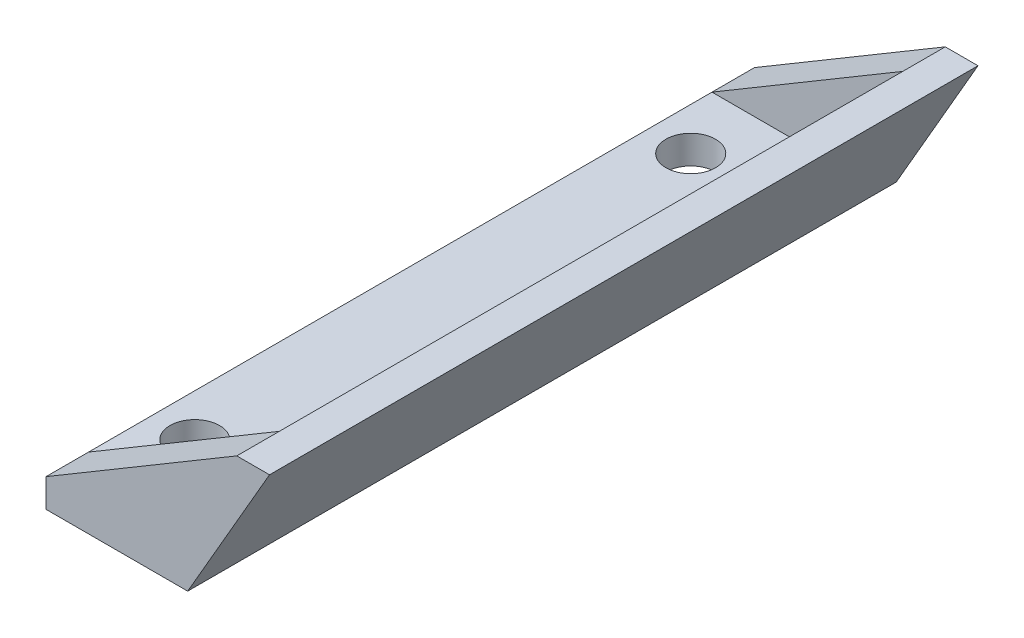
ISO-10303-21;
HEADER;
FILE_DESCRIPTION(('STEP AP214'),'2;1');
FILE_NAME('part.step','',(''),(''),'','','');
FILE_SCHEMA(('AUTOMOTIVE_DESIGN { 1 0 10303 214 1 1 1 1 }'));
ENDSEC;
DATA;
#1=APPLICATION_CONTEXT('core data for automotive mechanical design processes');
#2=APPLICATION_PROTOCOL_DEFINITION('international standard','automotive_design',2000,#1);
#3=PRODUCT_CONTEXT('',#1,'mechanical');
#4=PRODUCT('Part','Part','',(#3));
#5=PRODUCT_RELATED_PRODUCT_CATEGORY('part','',(#4));
#6=PRODUCT_DEFINITION_FORMATION('','',#4);
#7=PRODUCT_DEFINITION_CONTEXT('part definition',#1,'design');
#8=PRODUCT_DEFINITION('design','',#6,#7);
#9=PRODUCT_DEFINITION_SHAPE('','',#8);
#10=(LENGTH_UNIT() NAMED_UNIT(*) SI_UNIT(.MILLI.,.METRE.));
#11=(NAMED_UNIT(*) PLANE_ANGLE_UNIT() SI_UNIT($,.RADIAN.));
#12=(NAMED_UNIT(*) SI_UNIT($,.STERADIAN.) SOLID_ANGLE_UNIT());
#13=UNCERTAINTY_MEASURE_WITH_UNIT(LENGTH_MEASURE(1.E-05),#10,'distance_accuracy_value','');
#14=(GEOMETRIC_REPRESENTATION_CONTEXT(3) GLOBAL_UNCERTAINTY_ASSIGNED_CONTEXT((#13)) GLOBAL_UNIT_ASSIGNED_CONTEXT((#10,
#11,#12)) REPRESENTATION_CONTEXT('',''));
#15=CARTESIAN_POINT('',(0.,0.,0.));
#16=DIRECTION('',(0.,0.,1.));
#17=DIRECTION('',(1.,0.,0.));
#18=AXIS2_PLACEMENT_3D('',#15,#16,#17);
#19=CARTESIAN_POINT('',(-1.15470053837925,2.,-25.));
#20=DIRECTION('',(0.,1.,0.));
#21=DIRECTION('',(-1.,0.,0.));
#22=AXIS2_PLACEMENT_3D('',#19,#20,#21);
#23=PLANE('',#22);
#24=CARTESIAN_POINT('',(-6.99999999999999,2.,17.5));
#25=DIRECTION('',(0.,1.,0.));
#26=DIRECTION('',(-1.,0.,0.));
#27=AXIS2_PLACEMENT_3D('',#24,#25,#26);
#28=CIRCLE('',#27,1.75);
#29=CARTESIAN_POINT('',(-8.75,2.,17.5));
#30=VERTEX_POINT('',#29);
#31=EDGE_CURVE('E167',#30,#30,#28,.T.);
#32=ORIENTED_EDGE('',*,*,#31,.F.);
#33=EDGE_LOOP('',(#32));
#34=FACE_BOUND('',#33,.T.);
#35=CARTESIAN_POINT('',(-6.99999999999999,2.,-17.5));
#36=DIRECTION('',(0.,1.,0.));
#37=DIRECTION('',(-1.,0.,0.));
#38=AXIS2_PLACEMENT_3D('',#35,#36,#37);
#39=CIRCLE('',#38,1.75);
#40=CARTESIAN_POINT('',(-8.75,2.,-17.5));
#41=VERTEX_POINT('',#40);
#42=EDGE_CURVE('E170',#41,#41,#39,.T.);
#43=ORIENTED_EDGE('',*,*,#42,.F.);
#44=EDGE_LOOP('',(#43));
#45=FACE_BOUND('',#44,.T.);
#46=DIRECTION('',(0.,0.,1.));
#47=VECTOR('',#46,1.);
#48=CARTESIAN_POINT('',(-10.,2.,-25.));
#49=LINE('',#48,#47);
#50=CARTESIAN_POINT('',(-10.,2.,-22.));
#51=VERTEX_POINT('',#50);
#52=CARTESIAN_POINT('',(-10.,2.,22.));
#53=VERTEX_POINT('',#52);
#54=EDGE_CURVE('E46',#51,#53,#49,.T.);
#55=ORIENTED_EDGE('',*,*,#54,.T.);
#56=DIRECTION('',(-1.,0.,0.));
#57=VECTOR('',#56,1.);
#58=CARTESIAN_POINT('',(-10.,2.,22.));
#59=LINE('',#58,#57);
#60=CARTESIAN_POINT('',(-1.15470053837925,2.,22.));
#61=VERTEX_POINT('',#60);
#62=EDGE_CURVE('E111',#61,#53,#59,.T.);
#63=ORIENTED_EDGE('',*,*,#62,.F.);
#64=DIRECTION('',(0.,0.,1.));
#65=VECTOR('',#64,1.);
#66=CARTESIAN_POINT('',(-1.15470053837925,2.,-25.));
#67=LINE('',#66,#65);
#68=CARTESIAN_POINT('',(-1.15470053837925,2.,-22.));
#69=VERTEX_POINT('',#68);
#70=EDGE_CURVE('E129',#69,#61,#67,.T.);
#71=ORIENTED_EDGE('',*,*,#70,.F.);
#72=DIRECTION('',(-1.,0.,0.));
#73=VECTOR('',#72,1.);
#74=CARTESIAN_POINT('',(-10.,2.,-22.));
#75=LINE('',#74,#73);
#76=EDGE_CURVE('E54',#69,#51,#75,.T.);
#77=ORIENTED_EDGE('',*,*,#76,.T.);
#78=EDGE_LOOP('',(#55,#63,#71,#77));
#79=FACE_BOUND('',#78,.T.);
#80=ADVANCED_FACE('F37',(#34,#45,#79),#23,.T.);
#81=CARTESIAN_POINT('',(3.46410161513772,10.,-25.));
#82=DIRECTION('',(-0.86602540378444,0.499999999999998,0.));
#83=DIRECTION('',(-0.499999999999998,-0.86602540378444,0.));
#84=AXIS2_PLACEMENT_3D('',#81,#82,#83);
#85=PLANE('',#84);
#86=ORIENTED_EDGE('',*,*,#70,.T.);
#87=DIRECTION('',(-0.499999999999998,-0.86602540378444,0.));
#88=VECTOR('',#87,1.);
#89=CARTESIAN_POINT('',(-1.15470053837925,2.,22.));
#90=LINE('',#89,#88);
#91=CARTESIAN_POINT('',(3.46410161513772,10.,22.));
#92=VERTEX_POINT('',#91);
#93=EDGE_CURVE('E109',#92,#61,#90,.T.);
#94=ORIENTED_EDGE('',*,*,#93,.F.);
#95=DIRECTION('',(0.,0.,1.));
#96=VECTOR('',#95,1.);
#97=CARTESIAN_POINT('',(3.46410161513772,10.,-25.));
#98=LINE('',#97,#96);
#99=CARTESIAN_POINT('',(3.46410161513772,10.,-22.));
#100=VERTEX_POINT('',#99);
#101=EDGE_CURVE('E127',#100,#92,#98,.T.);
#102=ORIENTED_EDGE('',*,*,#101,.F.);
#103=DIRECTION('',(-0.499999999999998,-0.86602540378444,0.));
#104=VECTOR('',#103,1.);
#105=CARTESIAN_POINT('',(-1.15470053837925,2.,-22.));
#106=LINE('',#105,#104);
#107=EDGE_CURVE('E62',#100,#69,#106,.T.);
#108=ORIENTED_EDGE('',*,*,#107,.T.);
#109=EDGE_LOOP('',(#86,#94,#102,#108));
#110=FACE_BOUND('',#109,.T.);
#111=ADVANCED_FACE('F126',(#110),#85,.T.);
#112=CARTESIAN_POINT('',(-10.,2.,-25.));
#113=DIRECTION('',(-1.,0.,0.));
#114=DIRECTION('',(0.,0.,1.));
#115=AXIS2_PLACEMENT_3D('',#112,#113,#114);
#116=PLANE('',#115);
#117=DIRECTION('',(0.,0.,1.));
#118=VECTOR('',#117,1.);
#119=CARTESIAN_POINT('',(-10.,0.,-25.));
#120=LINE('',#119,#118);
#121=CARTESIAN_POINT('',(-10.,0.,-25.));
#122=VERTEX_POINT('',#121);
#123=CARTESIAN_POINT('',(-10.,0.,25.));
#124=VERTEX_POINT('',#123);
#125=EDGE_CURVE('E41',#122,#124,#120,.T.);
#126=ORIENTED_EDGE('',*,*,#125,.T.);
#127=DIRECTION('',(0.,-1.,0.));
#128=VECTOR('',#127,1.);
#129=CARTESIAN_POINT('',(-10.,2.,25.));
#130=LINE('',#129,#128);
#131=CARTESIAN_POINT('',(-10.,2.,25.));
#132=VERTEX_POINT('',#131);
#133=EDGE_CURVE('E164',#132,#124,#130,.T.);
#134=ORIENTED_EDGE('',*,*,#133,.F.);
#135=DIRECTION('',(0.,0.,1.));
#136=VECTOR('',#135,1.);
#137=CARTESIAN_POINT('',(-10.,2.,22.));
#138=LINE('',#137,#136);
#139=EDGE_CURVE('E124',#53,#132,#138,.T.);
#140=ORIENTED_EDGE('',*,*,#139,.F.);
#141=ORIENTED_EDGE('',*,*,#54,.F.);
#142=CARTESIAN_POINT('',(-10.,2.,-25.));
#143=VERTEX_POINT('',#142);
#144=EDGE_CURVE('E11',#143,#51,#49,.T.);
#145=ORIENTED_EDGE('',*,*,#144,.F.);
#146=DIRECTION('',(0.,-1.,0.));
#147=VECTOR('',#146,1.);
#148=CARTESIAN_POINT('',(-10.,2.,-25.));
#149=LINE('',#148,#147);
#150=EDGE_CURVE('E155',#143,#122,#149,.T.);
#151=ORIENTED_EDGE('',*,*,#150,.T.);
#152=EDGE_LOOP('',(#126,#134,#140,#141,#145,#151));
#153=FACE_BOUND('',#152,.T.);
#154=ADVANCED_FACE('F39',(#153),#116,.T.);
#155=CARTESIAN_POINT('',(5.77350269189622,10.,-25.));
#156=DIRECTION('',(0.,1.,0.));
#157=DIRECTION('',(0.,0.,1.));
#158=AXIS2_PLACEMENT_3D('',#155,#156,#157);
#159=PLANE('',#158);
#160=CARTESIAN_POINT('',(3.46410161513772,10.,-25.));
#161=VERTEX_POINT('',#160);
#162=EDGE_CURVE('E133',#161,#100,#98,.T.);
#163=ORIENTED_EDGE('',*,*,#162,.T.);
#164=ORIENTED_EDGE('',*,*,#101,.T.);
#165=DIRECTION('',(0.,0.,1.));
#166=VECTOR('',#165,1.);
#167=CARTESIAN_POINT('',(3.46410161513772,10.,22.));
#168=LINE('',#167,#166);
#169=CARTESIAN_POINT('',(3.46410161513772,10.,25.));
#170=VERTEX_POINT('',#169);
#171=EDGE_CURVE('E117',#92,#170,#168,.T.);
#172=ORIENTED_EDGE('',*,*,#171,.T.);
#173=DIRECTION('',(-1.,0.,0.));
#174=VECTOR('',#173,1.);
#175=CARTESIAN_POINT('',(5.77350269189622,10.,25.));
#176=LINE('',#175,#174);
#177=CARTESIAN_POINT('',(5.77350269189622,10.,25.));
#178=VERTEX_POINT('',#177);
#179=EDGE_CURVE('E157',#178,#170,#176,.T.);
#180=ORIENTED_EDGE('',*,*,#179,.F.);
#181=DIRECTION('',(0.,0.,1.));
#182=VECTOR('',#181,1.);
#183=CARTESIAN_POINT('',(5.77350269189622,10.,-25.));
#184=LINE('',#183,#182);
#185=CARTESIAN_POINT('',(5.77350269189622,10.,-25.));
#186=VERTEX_POINT('',#185);
#187=EDGE_CURVE('E134',#186,#178,#184,.T.);
#188=ORIENTED_EDGE('',*,*,#187,.F.);
#189=DIRECTION('',(-1.,0.,0.));
#190=VECTOR('',#189,1.);
#191=CARTESIAN_POINT('',(5.77350269189622,10.,-25.));
#192=LINE('',#191,#190);
#193=EDGE_CURVE('E143',#186,#161,#192,.T.);
#194=ORIENTED_EDGE('',*,*,#193,.T.);
#195=EDGE_LOOP('',(#163,#164,#172,#180,#188,#194));
#196=FACE_BOUND('',#195,.T.);
#197=ADVANCED_FACE('F131',(#196),#159,.T.);
#198=CARTESIAN_POINT('',(0.,0.,-25.));
#199=DIRECTION('',(0.86602540378444,-0.499999999999998,0.));
#200=DIRECTION('',(0.499999999999998,0.86602540378444,0.));
#201=AXIS2_PLACEMENT_3D('',#198,#199,#200);
#202=PLANE('',#201);
#203=ORIENTED_EDGE('',*,*,#187,.T.);
#204=DIRECTION('',(0.499999999999998,0.86602540378444,0.));
#205=VECTOR('',#204,1.);
#206=CARTESIAN_POINT('',(0.,0.,25.));
#207=LINE('',#206,#205);
#208=CARTESIAN_POINT('',(0.,0.,25.));
#209=VERTEX_POINT('',#208);
#210=EDGE_CURVE('E159',#209,#178,#207,.T.);
#211=ORIENTED_EDGE('',*,*,#210,.F.);
#212=DIRECTION('',(0.,0.,1.));
#213=VECTOR('',#212,1.);
#214=CARTESIAN_POINT('',(0.,0.,-25.));
#215=LINE('',#214,#213);
#216=CARTESIAN_POINT('',(0.,0.,-25.));
#217=VERTEX_POINT('',#216);
#218=EDGE_CURVE('E136',#217,#209,#215,.T.);
#219=ORIENTED_EDGE('',*,*,#218,.F.);
#220=DIRECTION('',(0.499999999999998,0.86602540378444,0.));
#221=VECTOR('',#220,1.);
#222=CARTESIAN_POINT('',(0.,0.,-25.));
#223=LINE('',#222,#221);
#224=EDGE_CURVE('E147',#217,#186,#223,.T.);
#225=ORIENTED_EDGE('',*,*,#224,.T.);
#226=EDGE_LOOP('',(#203,#211,#219,#225));
#227=FACE_BOUND('',#226,.T.);
#228=ADVANCED_FACE('F198',(#227),#202,.T.);
#229=CARTESIAN_POINT('',(-10.,0.,-25.));
#230=DIRECTION('',(0.,-1.,0.));
#231=DIRECTION('',(0.,0.,-1.));
#232=AXIS2_PLACEMENT_3D('',#229,#230,#231);
#233=PLANE('',#232);
#234=CARTESIAN_POINT('',(-6.99999999999999,0.,17.5));
#235=DIRECTION('',(0.,-1.,0.));
#236=DIRECTION('',(0.,0.,-1.));
#237=AXIS2_PLACEMENT_3D('',#234,#235,#236);
#238=CIRCLE('',#237,1.75);
#239=CARTESIAN_POINT('',(-6.99999999999999,0.,15.75));
#240=VERTEX_POINT('',#239);
#241=EDGE_CURVE('E173',#240,#240,#238,.T.);
#242=ORIENTED_EDGE('',*,*,#241,.F.);
#243=EDGE_LOOP('',(#242));
#244=FACE_BOUND('',#243,.T.);
#245=CARTESIAN_POINT('',(-6.99999999999999,0.,-17.5));
#246=DIRECTION('',(0.,-1.,0.));
#247=DIRECTION('',(0.,0.,-1.));
#248=AXIS2_PLACEMENT_3D('',#245,#246,#247);
#249=CIRCLE('',#248,1.75);
#250=CARTESIAN_POINT('',(-6.99999999999999,0.,-19.25));
#251=VERTEX_POINT('',#250);
#252=EDGE_CURVE('E174',#251,#251,#249,.T.);
#253=ORIENTED_EDGE('',*,*,#252,.F.);
#254=EDGE_LOOP('',(#253));
#255=FACE_BOUND('',#254,.T.);
#256=ORIENTED_EDGE('',*,*,#218,.T.);
#257=DIRECTION('',(1.,0.,0.));
#258=VECTOR('',#257,1.);
#259=CARTESIAN_POINT('',(-10.,0.,25.));
#260=LINE('',#259,#258);
#261=EDGE_CURVE('E162',#124,#209,#260,.T.);
#262=ORIENTED_EDGE('',*,*,#261,.F.);
#263=ORIENTED_EDGE('',*,*,#125,.F.);
#264=DIRECTION('',(1.,0.,0.));
#265=VECTOR('',#264,1.);
#266=CARTESIAN_POINT('',(-10.,0.,-25.));
#267=LINE('',#266,#265);
#268=EDGE_CURVE('E151',#122,#217,#267,.T.);
#269=ORIENTED_EDGE('',*,*,#268,.T.);
#270=EDGE_LOOP('',(#256,#262,#263,#269));
#271=FACE_BOUND('',#270,.T.);
#272=ADVANCED_FACE('F200',(#244,#255,#271),#233,.T.);
#273=CARTESIAN_POINT('',(0.,0.,-25.));
#274=DIRECTION('',(0.,0.,1.));
#275=DIRECTION('',(1.,0.,0.));
#276=AXIS2_PLACEMENT_3D('',#273,#274,#275);
#277=PLANE('',#276);
#278=ORIENTED_EDGE('',*,*,#150,.F.);
#279=DIRECTION('',(0.85969522134351,0.51080732805935,0.));
#280=VECTOR('',#279,1.);
#281=CARTESIAN_POINT('',(3.46410161513772,10.,-25.));
#282=LINE('',#281,#280);
#283=EDGE_CURVE('E180',#143,#161,#282,.T.);
#284=ORIENTED_EDGE('',*,*,#283,.T.);
#285=ORIENTED_EDGE('',*,*,#193,.F.);
#286=ORIENTED_EDGE('',*,*,#224,.F.);
#287=ORIENTED_EDGE('',*,*,#268,.F.);
#288=EDGE_LOOP('',(#278,#284,#285,#286,#287));
#289=FACE_BOUND('',#288,.T.);
#290=ADVANCED_FACE('F195',(#289),#277,.F.);
#291=CARTESIAN_POINT('',(0.,0.,25.));
#292=DIRECTION('',(0.,0.,1.));
#293=DIRECTION('',(1.,0.,0.));
#294=AXIS2_PLACEMENT_3D('',#291,#292,#293);
#295=PLANE('',#294);
#296=ORIENTED_EDGE('',*,*,#133,.T.);
#297=ORIENTED_EDGE('',*,*,#261,.T.);
#298=ORIENTED_EDGE('',*,*,#210,.T.);
#299=ORIENTED_EDGE('',*,*,#179,.T.);
#300=DIRECTION('',(0.85969522134351,0.51080732805935,0.));
#301=VECTOR('',#300,1.);
#302=CARTESIAN_POINT('',(3.46410161513772,10.,25.));
#303=LINE('',#302,#301);
#304=EDGE_CURVE('E119',#132,#170,#303,.T.);
#305=ORIENTED_EDGE('',*,*,#304,.F.);
#306=EDGE_LOOP('',(#296,#297,#298,#299,#305));
#307=FACE_BOUND('',#306,.T.);
#308=ADVANCED_FACE('F190',(#307),#295,.T.);
#309=CARTESIAN_POINT('',(-6.99999999999999,10.,-17.5));
#310=DIRECTION('',(0.,-1.,0.));
#311=DIRECTION('',(0.,0.,-1.));
#312=AXIS2_PLACEMENT_3D('',#309,#310,#311);
#313=CYLINDRICAL_SURFACE('',#312,1.75);
#314=ORIENTED_EDGE('',*,*,#42,.T.);
#315=EDGE_LOOP('',(#314));
#316=FACE_BOUND('',#315,.T.);
#317=ORIENTED_EDGE('',*,*,#252,.T.);
#318=EDGE_LOOP('',(#317));
#319=FACE_BOUND('',#318,.T.);
#320=ADVANCED_FACE('F222',(#316,#319),#313,.F.);
#321=CARTESIAN_POINT('',(-6.99999999999999,10.,17.5));
#322=DIRECTION('',(0.,-1.,0.));
#323=DIRECTION('',(0.,0.,-1.));
#324=AXIS2_PLACEMENT_3D('',#321,#322,#323);
#325=CYLINDRICAL_SURFACE('',#324,1.75);
#326=ORIENTED_EDGE('',*,*,#31,.T.);
#327=EDGE_LOOP('',(#326));
#328=FACE_BOUND('',#327,.T.);
#329=ORIENTED_EDGE('',*,*,#241,.T.);
#330=EDGE_LOOP('',(#329));
#331=FACE_BOUND('',#330,.T.);
#332=ADVANCED_FACE('F225',(#328,#331),#325,.F.);
#333=CARTESIAN_POINT('',(3.46410161513772,10.,-22.));
#334=DIRECTION('',(-0.51080732805935,0.85969522134351,0.));
#335=DIRECTION('',(-0.859695221343511,-0.51080732805935,0.));
#336=AXIS2_PLACEMENT_3D('',#333,#334,#335);
#337=PLANE('',#336);
#338=ORIENTED_EDGE('',*,*,#283,.F.);
#339=ORIENTED_EDGE('',*,*,#144,.T.);
#340=DIRECTION('',(0.85969522134351,0.51080732805935,0.));
#341=VECTOR('',#340,1.);
#342=CARTESIAN_POINT('',(3.46410161513772,10.,-22.));
#343=LINE('',#342,#341);
#344=EDGE_CURVE('E177',#51,#100,#343,.T.);
#345=ORIENTED_EDGE('',*,*,#344,.T.);
#346=ORIENTED_EDGE('',*,*,#162,.F.);
#347=EDGE_LOOP('',(#338,#339,#345,#346));
#348=FACE_BOUND('',#347,.T.);
#349=ADVANCED_FACE('F229',(#348),#337,.T.);
#350=CARTESIAN_POINT('',(0.,0.,-22.));
#351=DIRECTION('',(0.,0.,-1.));
#352=DIRECTION('',(-1.,0.,0.));
#353=AXIS2_PLACEMENT_3D('',#350,#351,#352);
#354=PLANE('',#353);
#355=ORIENTED_EDGE('',*,*,#107,.F.);
#356=ORIENTED_EDGE('',*,*,#344,.F.);
#357=ORIENTED_EDGE('',*,*,#76,.F.);
#358=EDGE_LOOP('',(#355,#356,#357));
#359=FACE_BOUND('',#358,.T.);
#360=ADVANCED_FACE('F233',(#359),#354,.F.);
#361=CARTESIAN_POINT('',(3.46410161513772,10.,22.));
#362=DIRECTION('',(0.51080732805935,-0.85969522134351,0.));
#363=DIRECTION('',(0.859695221343511,0.51080732805935,0.));
#364=AXIS2_PLACEMENT_3D('',#361,#362,#363);
#365=PLANE('',#364);
#366=ORIENTED_EDGE('',*,*,#304,.T.);
#367=ORIENTED_EDGE('',*,*,#171,.F.);
#368=DIRECTION('',(0.85969522134351,0.51080732805935,0.));
#369=VECTOR('',#368,1.);
#370=CARTESIAN_POINT('',(3.46410161513772,10.,22.));
#371=LINE('',#370,#369);
#372=EDGE_CURVE('E105',#53,#92,#371,.T.);
#373=ORIENTED_EDGE('',*,*,#372,.F.);
#374=ORIENTED_EDGE('',*,*,#139,.T.);
#375=EDGE_LOOP('',(#366,#367,#373,#374));
#376=FACE_BOUND('',#375,.T.);
#377=ADVANCED_FACE('F118',(#376),#365,.F.);
#378=CARTESIAN_POINT('',(0.,0.,22.));
#379=DIRECTION('',(0.,0.,1.));
#380=DIRECTION('',(-1.,0.,0.));
#381=AXIS2_PLACEMENT_3D('',#378,#379,#380);
#382=PLANE('',#381);
#383=ORIENTED_EDGE('',*,*,#93,.T.);
#384=ORIENTED_EDGE('',*,*,#62,.T.);
#385=ORIENTED_EDGE('',*,*,#372,.T.);
#386=EDGE_LOOP('',(#383,#384,#385));
#387=FACE_BOUND('',#386,.T.);
#388=ADVANCED_FACE('F107',(#387),#382,.F.);
#389=CLOSED_SHELL('',(#80,#111,#154,#197,#228,#272,#290,#308,#320,#332,#349,#360,#377,#388));
#390=MANIFOLD_SOLID_BREP('B2',#389);
#391=ADVANCED_BREP_SHAPE_REPRESENTATION('',(#18,#390),#14);
#392=SHAPE_DEFINITION_REPRESENTATION(#9,#391);
ENDSEC;
END-ISO-10303-21;
